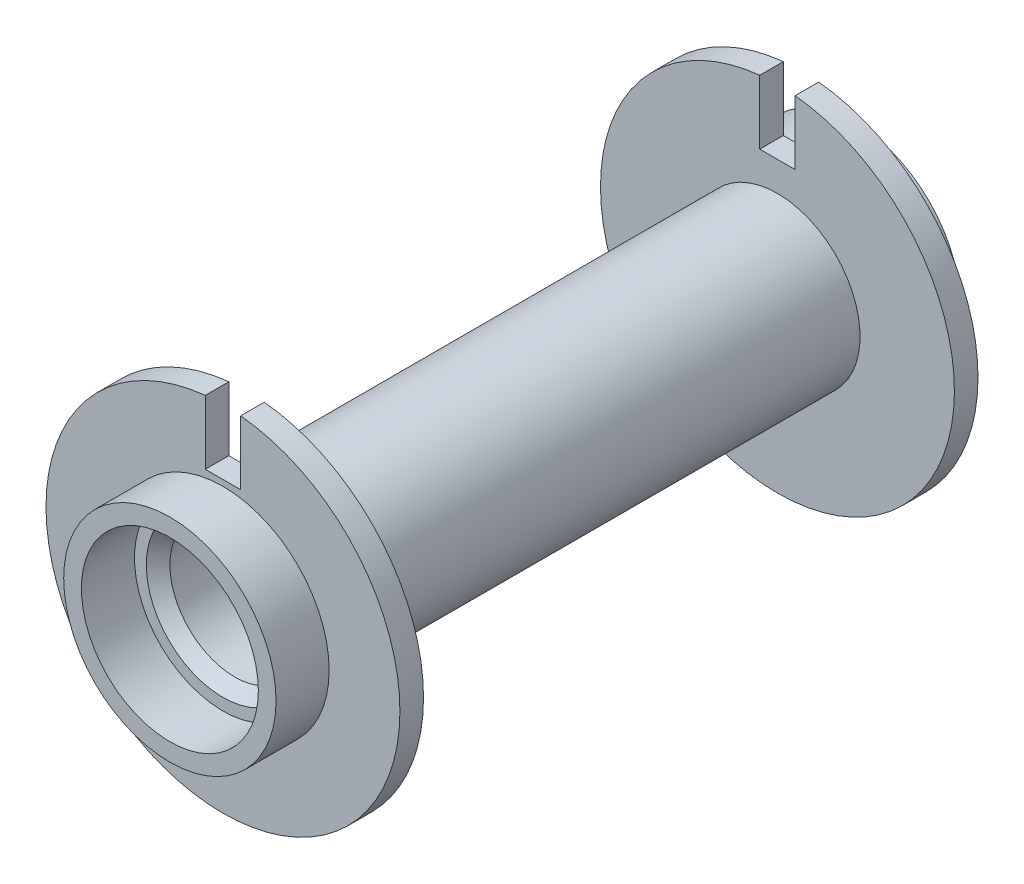
ISO-10303-21;
HEADER;
FILE_DESCRIPTION(('STEP AP214'),'2;1');
FILE_NAME('part.step','',(''),(''),'','','');
FILE_SCHEMA(('AUTOMOTIVE_DESIGN { 1 0 10303 214 1 1 1 1 }'));
ENDSEC;
DATA;
#1=APPLICATION_CONTEXT('core data for automotive mechanical design processes');
#2=APPLICATION_PROTOCOL_DEFINITION('international standard','automotive_design',2000,#1);
#3=PRODUCT_CONTEXT('',#1,'mechanical');
#4=PRODUCT('Part','Part','',(#3));
#5=PRODUCT_RELATED_PRODUCT_CATEGORY('part','',(#4));
#6=PRODUCT_DEFINITION_FORMATION('','',#4);
#7=PRODUCT_DEFINITION_CONTEXT('part definition',#1,'design');
#8=PRODUCT_DEFINITION('design','',#6,#7);
#9=PRODUCT_DEFINITION_SHAPE('','',#8);
#10=(LENGTH_UNIT() NAMED_UNIT(*) SI_UNIT(.MILLI.,.METRE.));
#11=(NAMED_UNIT(*) PLANE_ANGLE_UNIT() SI_UNIT($,.RADIAN.));
#12=(NAMED_UNIT(*) SI_UNIT($,.STERADIAN.) SOLID_ANGLE_UNIT());
#13=UNCERTAINTY_MEASURE_WITH_UNIT(LENGTH_MEASURE(1.E-05),#10,'distance_accuracy_value','');
#14=(GEOMETRIC_REPRESENTATION_CONTEXT(3) GLOBAL_UNCERTAINTY_ASSIGNED_CONTEXT((#13)) GLOBAL_UNIT_ASSIGNED_CONTEXT((#10,
#11,#12)) REPRESENTATION_CONTEXT('',''));
#15=CARTESIAN_POINT('',(0.,0.,0.));
#16=DIRECTION('',(0.,0.,1.));
#17=DIRECTION('',(1.,0.,0.));
#18=AXIS2_PLACEMENT_3D('',#15,#16,#17);
#19=CARTESIAN_POINT('',(0.,0.,-22.5));
#20=DIRECTION('',(0.,0.,-1.));
#21=DIRECTION('',(-1.,0.,0.));
#22=AXIS2_PLACEMENT_3D('',#19,#20,#21);
#23=CYLINDRICAL_SURFACE('',#22,15.);
#24=CARTESIAN_POINT('',(0.,0.,-24.5));
#25=DIRECTION('',(0.,0.,-1.));
#26=DIRECTION('',(-1.,0.,0.));
#27=AXIS2_PLACEMENT_3D('',#24,#25,#26);
#28=CIRCLE('',#27,15.);
#29=CARTESIAN_POINT('',(1.5,14.9248115565993,-24.5));
#30=VERTEX_POINT('',#29);
#31=CARTESIAN_POINT('',(-1.5,14.9248115565993,-24.5));
#32=VERTEX_POINT('',#31);
#33=EDGE_CURVE('E152',#30,#32,#28,.T.);
#34=ORIENTED_EDGE('',*,*,#33,.F.);
#35=DIRECTION('',(0.,0.,-1.));
#36=VECTOR('',#35,1.);
#37=CARTESIAN_POINT('',(1.5,14.9248115565993,-22.5));
#38=LINE('',#37,#36);
#39=CARTESIAN_POINT('',(1.5,14.9248115565993,-22.5));
#40=VERTEX_POINT('',#39);
#41=EDGE_CURVE('E104',#30,#40,#38,.F.);
#42=ORIENTED_EDGE('',*,*,#41,.T.);
#43=CARTESIAN_POINT('',(0.,0.,-22.5));
#44=DIRECTION('',(0.,0.,1.));
#45=DIRECTION('',(1.,0.,0.));
#46=AXIS2_PLACEMENT_3D('',#43,#44,#45);
#47=CIRCLE('',#46,15.);
#48=CARTESIAN_POINT('',(-1.5,14.9248115565993,-22.5));
#49=VERTEX_POINT('',#48);
#50=EDGE_CURVE('E178',#49,#40,#47,.T.);
#51=ORIENTED_EDGE('',*,*,#50,.F.);
#52=DIRECTION('',(0.,0.,-1.));
#53=VECTOR('',#52,1.);
#54=CARTESIAN_POINT('',(-1.5,14.9248115565993,-22.5));
#55=LINE('',#54,#53);
#56=EDGE_CURVE('E133',#49,#32,#55,.T.);
#57=ORIENTED_EDGE('',*,*,#56,.T.);
#58=EDGE_LOOP('',(#34,#42,#51,#57));
#59=FACE_BOUND('',#58,.T.);
#60=ADVANCED_FACE('F34',(#59),#23,.T.);
#61=CARTESIAN_POINT('',(0.,0.,29.5));
#62=DIRECTION('',(0.,0.,-1.));
#63=DIRECTION('',(-1.,0.,0.));
#64=AXIS2_PLACEMENT_3D('',#61,#62,#63);
#65=CYLINDRICAL_SURFACE('',#64,7.);
#66=CARTESIAN_POINT('',(0.,0.,22.5));
#67=DIRECTION('',(0.,0.,1.));
#68=DIRECTION('',(1.,0.,0.));
#69=AXIS2_PLACEMENT_3D('',#66,#67,#68);
#70=CIRCLE('',#69,7.);
#71=CARTESIAN_POINT('',(7.,0.,22.5));
#72=VERTEX_POINT('',#71);
#73=EDGE_CURVE('E185',#72,#72,#70,.T.);
#74=ORIENTED_EDGE('',*,*,#73,.F.);
#75=EDGE_LOOP('',(#74));
#76=FACE_BOUND('',#75,.T.);
#77=CARTESIAN_POINT('',(0.,0.,-22.5));
#78=DIRECTION('',(0.,0.,-1.));
#79=DIRECTION('',(-1.,0.,0.));
#80=AXIS2_PLACEMENT_3D('',#77,#78,#79);
#81=CIRCLE('',#80,7.);
#82=CARTESIAN_POINT('',(-7.,0.,-22.5));
#83=VERTEX_POINT('',#82);
#84=EDGE_CURVE('E182',#83,#83,#81,.T.);
#85=ORIENTED_EDGE('',*,*,#84,.F.);
#86=EDGE_LOOP('',(#85));
#87=FACE_BOUND('',#86,.T.);
#88=ADVANCED_FACE('F216',(#76,#87),#65,.T.);
#89=CARTESIAN_POINT('',(0.,0.,29.5));
#90=DIRECTION('',(0.,0.,-1.));
#91=DIRECTION('',(-1.,0.,0.));
#92=AXIS2_PLACEMENT_3D('',#89,#90,#91);
#93=CYLINDRICAL_SURFACE('',#92,5.5);
#94=CARTESIAN_POINT('',(0.,0.,23.5));
#95=DIRECTION('',(0.,0.,1.));
#96=DIRECTION('',(1.,0.,0.));
#97=AXIS2_PLACEMENT_3D('',#94,#95,#96);
#98=CIRCLE('',#97,5.5);
#99=CARTESIAN_POINT('',(5.5,0.,23.5));
#100=VERTEX_POINT('',#99);
#101=EDGE_CURVE('E196',#100,#100,#98,.T.);
#102=ORIENTED_EDGE('',*,*,#101,.T.);
#103=EDGE_LOOP('',(#102));
#104=FACE_BOUND('',#103,.T.);
#105=CARTESIAN_POINT('',(0.,0.,-23.5));
#106=DIRECTION('',(0.,0.,-1.));
#107=DIRECTION('',(-1.,0.,0.));
#108=AXIS2_PLACEMENT_3D('',#105,#106,#107);
#109=CIRCLE('',#108,5.5);
#110=CARTESIAN_POINT('',(-5.5,0.,-23.5));
#111=VERTEX_POINT('',#110);
#112=EDGE_CURVE('E158',#111,#111,#109,.T.);
#113=ORIENTED_EDGE('',*,*,#112,.T.);
#114=EDGE_LOOP('',(#113));
#115=FACE_BOUND('',#114,.T.);
#116=ADVANCED_FACE('F213',(#104,#115),#93,.F.);
#117=CARTESIAN_POINT('',(0.,0.,22.5));
#118=DIRECTION('',(0.,0.,1.));
#119=DIRECTION('',(1.,0.,0.));
#120=AXIS2_PLACEMENT_3D('',#117,#118,#119);
#121=PLANE('',#120);
#122=DIRECTION('',(1.,0.,0.));
#123=VECTOR('',#122,1.);
#124=CARTESIAN_POINT('',(0.,9.5,22.5));
#125=LINE('',#124,#123);
#126=CARTESIAN_POINT('',(-1.5,9.5,22.5));
#127=VERTEX_POINT('',#126);
#128=CARTESIAN_POINT('',(1.5,9.5,22.5));
#129=VERTEX_POINT('',#128);
#130=EDGE_CURVE('E149',#127,#129,#125,.T.);
#131=ORIENTED_EDGE('',*,*,#130,.T.);
#132=DIRECTION('',(0.,1.,0.));
#133=VECTOR('',#132,1.);
#134=CARTESIAN_POINT('',(1.5,0.,22.5));
#135=LINE('',#134,#133);
#136=CARTESIAN_POINT('',(1.5,14.9248115565993,22.5));
#137=VERTEX_POINT('',#136);
#138=EDGE_CURVE('E145',#129,#137,#135,.T.);
#139=ORIENTED_EDGE('',*,*,#138,.T.);
#140=CARTESIAN_POINT('',(0.,0.,22.5));
#141=DIRECTION('',(0.,0.,1.));
#142=DIRECTION('',(1.,0.,0.));
#143=AXIS2_PLACEMENT_3D('',#140,#141,#142);
#144=CIRCLE('',#143,15.);
#145=CARTESIAN_POINT('',(-1.5,14.9248115565993,22.5));
#146=VERTEX_POINT('',#145);
#147=EDGE_CURVE('E181',#146,#137,#144,.T.);
#148=ORIENTED_EDGE('',*,*,#147,.F.);
#149=DIRECTION('',(0.,-1.,0.));
#150=VECTOR('',#149,1.);
#151=CARTESIAN_POINT('',(-1.5,0.,22.5));
#152=LINE('',#151,#150);
#153=EDGE_CURVE('E137',#146,#127,#152,.T.);
#154=ORIENTED_EDGE('',*,*,#153,.T.);
#155=EDGE_LOOP('',(#131,#139,#148,#154));
#156=FACE_BOUND('',#155,.T.);
#157=ORIENTED_EDGE('',*,*,#73,.T.);
#158=EDGE_LOOP('',(#157));
#159=FACE_BOUND('',#158,.T.);
#160=ADVANCED_FACE('F215',(#156,#159),#121,.F.);
#161=CARTESIAN_POINT('',(0.,0.,22.5));
#162=DIRECTION('',(0.,0.,1.));
#163=DIRECTION('',(1.,0.,0.));
#164=AXIS2_PLACEMENT_3D('',#161,#162,#163);
#165=CYLINDRICAL_SURFACE('',#164,15.);
#166=DIRECTION('',(0.,0.,1.));
#167=VECTOR('',#166,1.);
#168=CARTESIAN_POINT('',(1.5,14.9248115565993,22.5));
#169=LINE('',#168,#167);
#170=CARTESIAN_POINT('',(1.5,14.9248115565993,24.5));
#171=VERTEX_POINT('',#170);
#172=EDGE_CURVE('E143',#171,#137,#169,.F.);
#173=ORIENTED_EDGE('',*,*,#172,.F.);
#174=CARTESIAN_POINT('',(0.,0.,24.5));
#175=DIRECTION('',(0.,0.,1.));
#176=DIRECTION('',(1.,0.,0.));
#177=AXIS2_PLACEMENT_3D('',#174,#175,#176);
#178=CIRCLE('',#177,15.);
#179=CARTESIAN_POINT('',(-1.5,14.9248115565993,24.5));
#180=VERTEX_POINT('',#179);
#181=EDGE_CURVE('E160',#180,#171,#178,.T.);
#182=ORIENTED_EDGE('',*,*,#181,.F.);
#183=DIRECTION('',(0.,0.,1.));
#184=VECTOR('',#183,1.);
#185=CARTESIAN_POINT('',(-1.5,14.9248115565993,22.5));
#186=LINE('',#185,#184);
#187=EDGE_CURVE('E49',#146,#180,#186,.T.);
#188=ORIENTED_EDGE('',*,*,#187,.F.);
#189=ORIENTED_EDGE('',*,*,#147,.T.);
#190=EDGE_LOOP('',(#173,#182,#188,#189));
#191=FACE_BOUND('',#190,.T.);
#192=ADVANCED_FACE('F223',(#191),#165,.T.);
#193=CARTESIAN_POINT('',(0.,0.,-22.5));
#194=DIRECTION('',(0.,0.,-1.));
#195=DIRECTION('',(1.,0.,0.));
#196=AXIS2_PLACEMENT_3D('',#193,#194,#195);
#197=PLANE('',#196);
#198=ORIENTED_EDGE('',*,*,#50,.T.);
#199=DIRECTION('',(0.,-1.,0.));
#200=VECTOR('',#199,1.);
#201=CARTESIAN_POINT('',(1.5,0.,-22.5));
#202=LINE('',#201,#200);
#203=CARTESIAN_POINT('',(1.5,9.5,-22.5));
#204=VERTEX_POINT('',#203);
#205=EDGE_CURVE('E140',#40,#204,#202,.T.);
#206=ORIENTED_EDGE('',*,*,#205,.T.);
#207=DIRECTION('',(-1.,0.,0.));
#208=VECTOR('',#207,1.);
#209=CARTESIAN_POINT('',(0.,9.5,-22.5));
#210=LINE('',#209,#208);
#211=CARTESIAN_POINT('',(-1.5,9.5,-22.5));
#212=VERTEX_POINT('',#211);
#213=EDGE_CURVE('E116',#204,#212,#210,.T.);
#214=ORIENTED_EDGE('',*,*,#213,.T.);
#215=DIRECTION('',(0.,1.,0.));
#216=VECTOR('',#215,1.);
#217=CARTESIAN_POINT('',(-1.5,0.,-22.5));
#218=LINE('',#217,#216);
#219=EDGE_CURVE('E130',#212,#49,#218,.T.);
#220=ORIENTED_EDGE('',*,*,#219,.T.);
#221=EDGE_LOOP('',(#198,#206,#214,#220));
#222=FACE_BOUND('',#221,.T.);
#223=ORIENTED_EDGE('',*,*,#84,.T.);
#224=EDGE_LOOP('',(#223));
#225=FACE_BOUND('',#224,.T.);
#226=ADVANCED_FACE('F235',(#222,#225),#197,.F.);
#227=CARTESIAN_POINT('',(0.,0.,24.5));
#228=DIRECTION('',(0.,0.,1.));
#229=DIRECTION('',(1.,0.,0.));
#230=AXIS2_PLACEMENT_3D('',#227,#228,#229);
#231=PLANE('',#230);
#232=CARTESIAN_POINT('',(0.,0.,24.5));
#233=DIRECTION('',(0.,0.,1.));
#234=DIRECTION('',(1.,0.,0.));
#235=AXIS2_PLACEMENT_3D('',#232,#233,#234);
#236=CIRCLE('',#235,6.50000000000001);
#237=CARTESIAN_POINT('',(6.50000000000001,0.,24.5));
#238=VERTEX_POINT('',#237);
#239=EDGE_CURVE('E199',#238,#238,#236,.F.);
#240=ORIENTED_EDGE('',*,*,#239,.T.);
#241=EDGE_LOOP('',(#240));
#242=FACE_BOUND('',#241,.T.);
#243=CARTESIAN_POINT('',(0.,0.,24.5));
#244=DIRECTION('',(0.,0.,1.));
#245=DIRECTION('',(1.,0.,0.));
#246=AXIS2_PLACEMENT_3D('',#243,#244,#245);
#247=CIRCLE('',#246,7.5);
#248=CARTESIAN_POINT('',(7.5,0.,24.5));
#249=VERTEX_POINT('',#248);
#250=EDGE_CURVE('E159',#249,#249,#247,.T.);
#251=ORIENTED_EDGE('',*,*,#250,.T.);
#252=EDGE_LOOP('',(#251));
#253=FACE_BOUND('',#252,.T.);
#254=ADVANCED_FACE('F242',(#242,#253),#231,.T.);
#255=CARTESIAN_POINT('',(0.,0.,29.));
#256=DIRECTION('',(0.,0.,-1.));
#257=DIRECTION('',(-1.,0.,0.));
#258=AXIS2_PLACEMENT_3D('',#255,#256,#257);
#259=CYLINDRICAL_SURFACE('',#258,9.);
#260=CARTESIAN_POINT('',(0.,0.,24.5));
#261=DIRECTION('',(0.,0.,1.));
#262=DIRECTION('',(1.,0.,0.));
#263=AXIS2_PLACEMENT_3D('',#260,#261,#262);
#264=CIRCLE('',#263,9.);
#265=CARTESIAN_POINT('',(9.,0.,24.5));
#266=VERTEX_POINT('',#265);
#267=EDGE_CURVE('E163',#266,#266,#264,.T.);
#268=ORIENTED_EDGE('',*,*,#267,.T.);
#269=EDGE_LOOP('',(#268));
#270=FACE_BOUND('',#269,.T.);
#271=CARTESIAN_POINT('',(0.,0.,29.));
#272=DIRECTION('',(0.,0.,1.));
#273=DIRECTION('',(1.,0.,0.));
#274=AXIS2_PLACEMENT_3D('',#271,#272,#273);
#275=CIRCLE('',#274,9.);
#276=CARTESIAN_POINT('',(9.,0.,29.));
#277=VERTEX_POINT('',#276);
#278=EDGE_CURVE('E175',#277,#277,#275,.T.);
#279=ORIENTED_EDGE('',*,*,#278,.F.);
#280=EDGE_LOOP('',(#279));
#281=FACE_BOUND('',#280,.T.);
#282=ADVANCED_FACE('F350',(#270,#281),#259,.T.);
#283=CARTESIAN_POINT('',(0.,0.,29.));
#284=DIRECTION('',(0.,0.,1.));
#285=DIRECTION('',(1.,0.,0.));
#286=AXIS2_PLACEMENT_3D('',#283,#284,#285);
#287=PLANE('',#286);
#288=ORIENTED_EDGE('',*,*,#278,.T.);
#289=EDGE_LOOP('',(#288));
#290=FACE_BOUND('',#289,.T.);
#291=CARTESIAN_POINT('',(0.,0.,29.));
#292=DIRECTION('',(0.,0.,1.));
#293=DIRECTION('',(1.,0.,0.));
#294=AXIS2_PLACEMENT_3D('',#291,#292,#293);
#295=CIRCLE('',#294,7.5);
#296=CARTESIAN_POINT('',(7.5,0.,29.));
#297=VERTEX_POINT('',#296);
#298=EDGE_CURVE('E172',#297,#297,#295,.T.);
#299=ORIENTED_EDGE('',*,*,#298,.F.);
#300=EDGE_LOOP('',(#299));
#301=FACE_BOUND('',#300,.T.);
#302=ADVANCED_FACE('F343',(#290,#301),#287,.T.);
#303=CARTESIAN_POINT('',(0.,0.,29.));
#304=DIRECTION('',(0.,0.,-1.));
#305=DIRECTION('',(-1.,0.,0.));
#306=AXIS2_PLACEMENT_3D('',#303,#304,#305);
#307=CYLINDRICAL_SURFACE('',#306,7.5);
#308=ORIENTED_EDGE('',*,*,#250,.F.);
#309=EDGE_LOOP('',(#308));
#310=FACE_BOUND('',#309,.T.);
#311=ORIENTED_EDGE('',*,*,#298,.T.);
#312=EDGE_LOOP('',(#311));
#313=FACE_BOUND('',#312,.T.);
#314=ADVANCED_FACE('F336',(#310,#313),#307,.F.);
#315=DIRECTION('',(0.,1.,0.));
#316=VECTOR('',#315,1.);
#317=CARTESIAN_POINT('',(1.5,15.,24.5));
#318=LINE('',#317,#316);
#319=CARTESIAN_POINT('',(1.5,9.5,24.5));
#320=VERTEX_POINT('',#319);
#321=EDGE_CURVE('E121',#320,#171,#318,.T.);
#322=ORIENTED_EDGE('',*,*,#321,.F.);
#323=DIRECTION('',(1.,0.,0.));
#324=VECTOR('',#323,1.);
#325=CARTESIAN_POINT('',(-1.5,9.5,24.5));
#326=LINE('',#325,#324);
#327=CARTESIAN_POINT('',(-1.5,9.5,24.5));
#328=VERTEX_POINT('',#327);
#329=EDGE_CURVE('E123',#328,#320,#326,.T.);
#330=ORIENTED_EDGE('',*,*,#329,.F.);
#331=DIRECTION('',(0.,-1.,0.));
#332=VECTOR('',#331,1.);
#333=CARTESIAN_POINT('',(-1.5,15.,24.5));
#334=LINE('',#333,#332);
#335=EDGE_CURVE('E126',#180,#328,#334,.T.);
#336=ORIENTED_EDGE('',*,*,#335,.F.);
#337=ORIENTED_EDGE('',*,*,#181,.T.);
#338=EDGE_LOOP('',(#322,#330,#336,#337));
#339=FACE_BOUND('',#338,.T.);
#340=ORIENTED_EDGE('',*,*,#267,.F.);
#341=EDGE_LOOP('',(#340));
#342=FACE_BOUND('',#341,.T.);
#343=ADVANCED_FACE('F250',(#339,#342),#231,.T.);
#344=CARTESIAN_POINT('',(0.,0.,-24.5));
#345=DIRECTION('',(0.,0.,-1.));
#346=DIRECTION('',(-1.,0.,0.));
#347=AXIS2_PLACEMENT_3D('',#344,#345,#346);
#348=PLANE('',#347);
#349=CARTESIAN_POINT('',(0.,0.,-24.5));
#350=DIRECTION('',(0.,0.,-1.));
#351=DIRECTION('',(-1.,0.,0.));
#352=AXIS2_PLACEMENT_3D('',#349,#350,#351);
#353=CIRCLE('',#352,6.50000000000001);
#354=CARTESIAN_POINT('',(-6.50000000000001,0.,-24.5));
#355=VERTEX_POINT('',#354);
#356=EDGE_CURVE('E42',#355,#355,#353,.F.);
#357=ORIENTED_EDGE('',*,*,#356,.T.);
#358=EDGE_LOOP('',(#357));
#359=FACE_BOUND('',#358,.T.);
#360=CARTESIAN_POINT('',(0.,0.,-24.5));
#361=DIRECTION('',(0.,0.,-1.));
#362=DIRECTION('',(-1.,0.,0.));
#363=AXIS2_PLACEMENT_3D('',#360,#361,#362);
#364=CIRCLE('',#363,7.5);
#365=CARTESIAN_POINT('',(-7.5,0.,-24.5));
#366=VERTEX_POINT('',#365);
#367=EDGE_CURVE('E154',#366,#366,#364,.F.);
#368=ORIENTED_EDGE('',*,*,#367,.F.);
#369=EDGE_LOOP('',(#368));
#370=FACE_BOUND('',#369,.T.);
#371=ADVANCED_FACE('F204',(#359,#370),#348,.T.);
#372=DIRECTION('',(0.,1.,0.));
#373=VECTOR('',#372,1.);
#374=CARTESIAN_POINT('',(1.5,15.,-24.5));
#375=LINE('',#374,#373);
#376=CARTESIAN_POINT('',(1.5,9.5,-24.5));
#377=VERTEX_POINT('',#376);
#378=EDGE_CURVE('E98',#377,#30,#375,.T.);
#379=ORIENTED_EDGE('',*,*,#378,.T.);
#380=ORIENTED_EDGE('',*,*,#33,.T.);
#381=DIRECTION('',(0.,1.,0.));
#382=VECTOR('',#381,1.);
#383=CARTESIAN_POINT('',(-1.5,0.,-24.5));
#384=LINE('',#383,#382);
#385=CARTESIAN_POINT('',(-1.5,9.5,-24.5));
#386=VERTEX_POINT('',#385);
#387=EDGE_CURVE('E11',#386,#32,#384,.T.);
#388=ORIENTED_EDGE('',*,*,#387,.F.);
#389=DIRECTION('',(1.,0.,0.));
#390=VECTOR('',#389,1.);
#391=CARTESIAN_POINT('',(-1.5,9.5,-24.5));
#392=LINE('',#391,#390);
#393=EDGE_CURVE('E113',#386,#377,#392,.T.);
#394=ORIENTED_EDGE('',*,*,#393,.T.);
#395=EDGE_LOOP('',(#379,#380,#388,#394));
#396=FACE_BOUND('',#395,.T.);
#397=CARTESIAN_POINT('',(0.,0.,-24.5));
#398=DIRECTION('',(0.,0.,-1.));
#399=DIRECTION('',(-1.,0.,0.));
#400=AXIS2_PLACEMENT_3D('',#397,#398,#399);
#401=CIRCLE('',#400,9.);
#402=CARTESIAN_POINT('',(-9.,0.,-24.5));
#403=VERTEX_POINT('',#402);
#404=EDGE_CURVE('E155',#403,#403,#401,.F.);
#405=ORIENTED_EDGE('',*,*,#404,.T.);
#406=EDGE_LOOP('',(#405));
#407=FACE_BOUND('',#406,.T.);
#408=ADVANCED_FACE('F119',(#396,#407),#348,.T.);
#409=CARTESIAN_POINT('',(0.,0.,-29.));
#410=DIRECTION('',(0.,0.,1.));
#411=DIRECTION('',(1.,0.,0.));
#412=AXIS2_PLACEMENT_3D('',#409,#410,#411);
#413=CYLINDRICAL_SURFACE('',#412,9.);
#414=ORIENTED_EDGE('',*,*,#404,.F.);
#415=EDGE_LOOP('',(#414));
#416=FACE_BOUND('',#415,.T.);
#417=CARTESIAN_POINT('',(0.,0.,-29.));
#418=DIRECTION('',(0.,0.,1.));
#419=DIRECTION('',(1.,0.,0.));
#420=AXIS2_PLACEMENT_3D('',#417,#418,#419);
#421=CIRCLE('',#420,9.);
#422=CARTESIAN_POINT('',(9.,0.,-29.));
#423=VERTEX_POINT('',#422);
#424=EDGE_CURVE('E169',#423,#423,#421,.T.);
#425=ORIENTED_EDGE('',*,*,#424,.T.);
#426=EDGE_LOOP('',(#425));
#427=FACE_BOUND('',#426,.T.);
#428=ADVANCED_FACE('F309',(#416,#427),#413,.T.);
#429=CARTESIAN_POINT('',(0.,0.,-29.));
#430=DIRECTION('',(0.,0.,-1.));
#431=DIRECTION('',(1.,0.,0.));
#432=AXIS2_PLACEMENT_3D('',#429,#430,#431);
#433=PLANE('',#432);
#434=CARTESIAN_POINT('',(0.,0.,-29.));
#435=DIRECTION('',(0.,0.,1.));
#436=DIRECTION('',(1.,0.,0.));
#437=AXIS2_PLACEMENT_3D('',#434,#435,#436);
#438=CIRCLE('',#437,7.5);
#439=CARTESIAN_POINT('',(7.5,0.,-29.));
#440=VERTEX_POINT('',#439);
#441=EDGE_CURVE('E166',#440,#440,#438,.T.);
#442=ORIENTED_EDGE('',*,*,#441,.T.);
#443=EDGE_LOOP('',(#442));
#444=FACE_BOUND('',#443,.T.);
#445=ORIENTED_EDGE('',*,*,#424,.F.);
#446=EDGE_LOOP('',(#445));
#447=FACE_BOUND('',#446,.T.);
#448=ADVANCED_FACE('F300',(#444,#447),#433,.T.);
#449=CARTESIAN_POINT('',(0.,0.,-29.));
#450=DIRECTION('',(0.,0.,1.));
#451=DIRECTION('',(1.,0.,0.));
#452=AXIS2_PLACEMENT_3D('',#449,#450,#451);
#453=CYLINDRICAL_SURFACE('',#452,7.5);
#454=ORIENTED_EDGE('',*,*,#367,.T.);
#455=EDGE_LOOP('',(#454));
#456=FACE_BOUND('',#455,.T.);
#457=ORIENTED_EDGE('',*,*,#441,.F.);
#458=EDGE_LOOP('',(#457));
#459=FACE_BOUND('',#458,.T.);
#460=ADVANCED_FACE('F292',(#456,#459),#453,.F.);
#461=CARTESIAN_POINT('',(0.,0.,23.5));
#462=DIRECTION('',(0.,0.,1.));
#463=DIRECTION('',(1.,0.,0.));
#464=AXIS2_PLACEMENT_3D('',#461,#462,#463);
#465=CONICAL_SURFACE('',#464,5.5,0.785398163397446);
#466=ORIENTED_EDGE('',*,*,#239,.F.);
#467=EDGE_LOOP('',(#466));
#468=FACE_BOUND('',#467,.T.);
#469=ORIENTED_EDGE('',*,*,#101,.F.);
#470=EDGE_LOOP('',(#469));
#471=FACE_BOUND('',#470,.T.);
#472=ADVANCED_FACE('F210',(#468,#471),#465,.F.);
#473=CARTESIAN_POINT('',(0.,0.,-23.5));
#474=DIRECTION('',(0.,0.,-1.));
#475=DIRECTION('',(-1.,0.,0.));
#476=AXIS2_PLACEMENT_3D('',#473,#474,#475);
#477=CONICAL_SURFACE('',#476,5.5,0.785398163397447);
#478=ORIENTED_EDGE('',*,*,#356,.F.);
#479=EDGE_LOOP('',(#478));
#480=FACE_BOUND('',#479,.T.);
#481=ORIENTED_EDGE('',*,*,#112,.F.);
#482=EDGE_LOOP('',(#481));
#483=FACE_BOUND('',#482,.T.);
#484=ADVANCED_FACE('F36',(#480,#483),#477,.F.);
#485=CARTESIAN_POINT('',(-1.5,15.,-30.7649820430708));
#486=DIRECTION('',(-1.,0.,0.));
#487=DIRECTION('',(0.,-1.,0.));
#488=AXIS2_PLACEMENT_3D('',#485,#486,#487);
#489=PLANE('',#488);
#490=ORIENTED_EDGE('',*,*,#219,.F.);
#491=DIRECTION('',(0.,0.,1.));
#492=VECTOR('',#491,1.);
#493=CARTESIAN_POINT('',(-1.5,9.5,-30.7649820430708));
#494=LINE('',#493,#492);
#495=EDGE_CURVE('E56',#386,#212,#494,.T.);
#496=ORIENTED_EDGE('',*,*,#495,.F.);
#497=ORIENTED_EDGE('',*,*,#387,.T.);
#498=ORIENTED_EDGE('',*,*,#56,.F.);
#499=EDGE_LOOP('',(#490,#496,#497,#498));
#500=FACE_BOUND('',#499,.T.);
#501=ADVANCED_FACE('F209',(#500),#489,.F.);
#502=CARTESIAN_POINT('',(1.5,15.,-30.7649820430708));
#503=DIRECTION('',(1.,0.,0.));
#504=DIRECTION('',(0.,1.,0.));
#505=AXIS2_PLACEMENT_3D('',#502,#503,#504);
#506=PLANE('',#505);
#507=ORIENTED_EDGE('',*,*,#378,.F.);
#508=DIRECTION('',(0.,0.,1.));
#509=VECTOR('',#508,1.);
#510=CARTESIAN_POINT('',(1.5,9.5,-30.7649820430708));
#511=LINE('',#510,#509);
#512=EDGE_CURVE('E101',#377,#204,#511,.T.);
#513=ORIENTED_EDGE('',*,*,#512,.T.);
#514=ORIENTED_EDGE('',*,*,#205,.F.);
#515=ORIENTED_EDGE('',*,*,#41,.F.);
#516=EDGE_LOOP('',(#507,#513,#514,#515));
#517=FACE_BOUND('',#516,.T.);
#518=ADVANCED_FACE('F100',(#517),#506,.F.);
#519=CARTESIAN_POINT('',(-1.5,9.5,-30.7649820430708));
#520=DIRECTION('',(0.,-1.,0.));
#521=DIRECTION('',(0.,0.,-1.));
#522=AXIS2_PLACEMENT_3D('',#519,#520,#521);
#523=PLANE('',#522);
#524=ORIENTED_EDGE('',*,*,#512,.F.);
#525=ORIENTED_EDGE('',*,*,#393,.F.);
#526=ORIENTED_EDGE('',*,*,#495,.T.);
#527=ORIENTED_EDGE('',*,*,#213,.F.);
#528=EDGE_LOOP('',(#524,#525,#526,#527));
#529=FACE_BOUND('',#528,.T.);
#530=ADVANCED_FACE('F112',(#529),#523,.F.);
#531=EDGE_CURVE('E109',#127,#328,#494,.T.);
#532=ORIENTED_EDGE('',*,*,#531,.T.);
#533=ORIENTED_EDGE('',*,*,#329,.T.);
#534=EDGE_CURVE('E117',#129,#320,#511,.T.);
#535=ORIENTED_EDGE('',*,*,#534,.F.);
#536=ORIENTED_EDGE('',*,*,#130,.F.);
#537=EDGE_LOOP('',(#532,#533,#535,#536));
#538=FACE_BOUND('',#537,.T.);
#539=ADVANCED_FACE('F258',(#538),#523,.F.);
#540=ORIENTED_EDGE('',*,*,#534,.T.);
#541=ORIENTED_EDGE('',*,*,#321,.T.);
#542=ORIENTED_EDGE('',*,*,#172,.T.);
#543=ORIENTED_EDGE('',*,*,#138,.F.);
#544=EDGE_LOOP('',(#540,#541,#542,#543));
#545=FACE_BOUND('',#544,.T.);
#546=ADVANCED_FACE('F261',(#545),#506,.F.);
#547=ORIENTED_EDGE('',*,*,#187,.T.);
#548=ORIENTED_EDGE('',*,*,#335,.T.);
#549=ORIENTED_EDGE('',*,*,#531,.F.);
#550=ORIENTED_EDGE('',*,*,#153,.F.);
#551=EDGE_LOOP('',(#547,#548,#549,#550));
#552=FACE_BOUND('',#551,.T.);
#553=ADVANCED_FACE('F259',(#552),#489,.F.);
#554=CLOSED_SHELL('',(#60,#88,#116,#160,#192,#226,#254,#282,#302,#314,#343,#371,#408,#428,#448,
#460,#472,#484,#501,#518,#530,#539,#546,#553));
#555=MANIFOLD_SOLID_BREP('B2',#554);
#556=ADVANCED_BREP_SHAPE_REPRESENTATION('',(#18,#555),#14);
#557=SHAPE_DEFINITION_REPRESENTATION(#9,#556);
ENDSEC;
END-ISO-10303-21;
